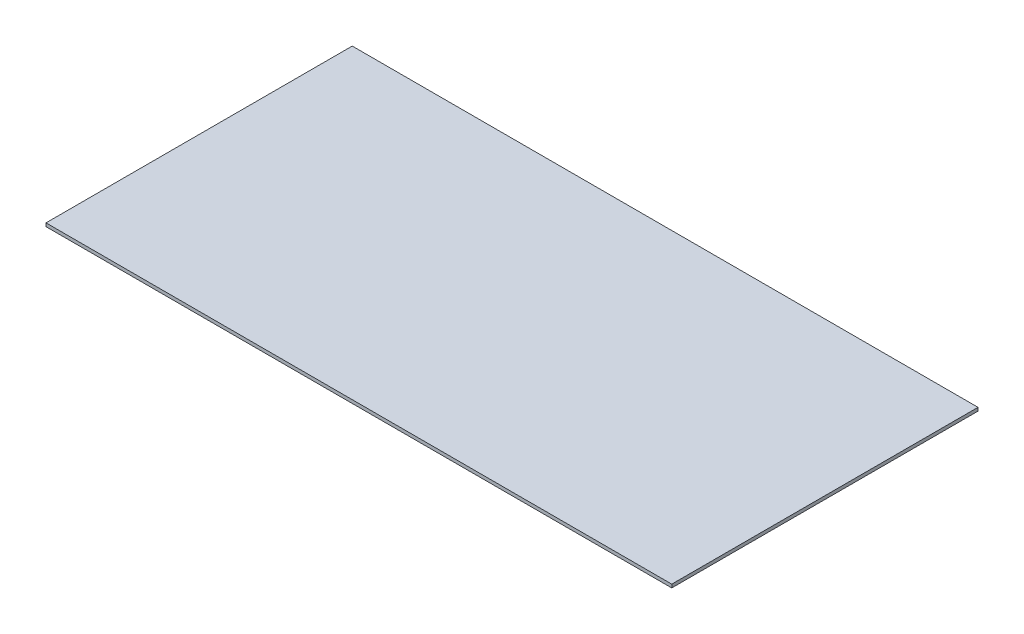
ISO-10303-21;
HEADER;
FILE_DESCRIPTION(('STEP AP214'),'2;1');
FILE_NAME('part.step','',(''),(''),'','','');
FILE_SCHEMA(('AUTOMOTIVE_DESIGN { 1 0 10303 214 1 1 1 1 }'));
ENDSEC;
DATA;
#1=APPLICATION_CONTEXT('core data for automotive mechanical design processes');
#2=APPLICATION_PROTOCOL_DEFINITION('international standard','automotive_design',2000,#1);
#3=PRODUCT_CONTEXT('',#1,'mechanical');
#4=PRODUCT('Part','Part','',(#3));
#5=PRODUCT_RELATED_PRODUCT_CATEGORY('part','',(#4));
#6=PRODUCT_DEFINITION_FORMATION('','',#4);
#7=PRODUCT_DEFINITION_CONTEXT('part definition',#1,'design');
#8=PRODUCT_DEFINITION('design','',#6,#7);
#9=PRODUCT_DEFINITION_SHAPE('','',#8);
#10=(LENGTH_UNIT() NAMED_UNIT(*) SI_UNIT(.MILLI.,.METRE.));
#11=(NAMED_UNIT(*) PLANE_ANGLE_UNIT() SI_UNIT($,.RADIAN.));
#12=(NAMED_UNIT(*) SI_UNIT($,.STERADIAN.) SOLID_ANGLE_UNIT());
#13=UNCERTAINTY_MEASURE_WITH_UNIT(LENGTH_MEASURE(1.E-05),#10,'distance_accuracy_value','');
#14=(GEOMETRIC_REPRESENTATION_CONTEXT(3) GLOBAL_UNCERTAINTY_ASSIGNED_CONTEXT((#13)) GLOBAL_UNIT_ASSIGNED_CONTEXT((#10,
#11,#12)) REPRESENTATION_CONTEXT('',''));
#15=CARTESIAN_POINT('',(0.,0.,0.));
#16=DIRECTION('',(0.,0.,1.));
#17=DIRECTION('',(1.,0.,0.));
#18=AXIS2_PLACEMENT_3D('',#15,#16,#17);
#19=CARTESIAN_POINT('',(0.,3.,0.));
#20=DIRECTION('',(1.,0.,0.));
#21=DIRECTION('',(0.,0.,-1.));
#22=AXIS2_PLACEMENT_3D('',#19,#20,#21);
#23=PLANE('',#22);
#24=DIRECTION('',(0.,0.,1.));
#25=VECTOR('',#24,1.);
#26=CARTESIAN_POINT('',(0.,0.,0.));
#27=LINE('',#26,#25);
#28=CARTESIAN_POINT('',(0.,0.,-277.));
#29=VERTEX_POINT('',#28);
#30=CARTESIAN_POINT('',(0.,0.,0.));
#31=VERTEX_POINT('',#30);
#32=EDGE_CURVE('E96',#29,#31,#27,.T.);
#33=ORIENTED_EDGE('',*,*,#32,.T.);
#34=DIRECTION('',(0.,-1.,0.));
#35=VECTOR('',#34,1.);
#36=CARTESIAN_POINT('',(0.,3.,0.));
#37=LINE('',#36,#35);
#38=CARTESIAN_POINT('',(0.,3.,0.));
#39=VERTEX_POINT('',#38);
#40=EDGE_CURVE('E11',#39,#31,#37,.T.);
#41=ORIENTED_EDGE('',*,*,#40,.F.);
#42=DIRECTION('',(0.,0.,1.));
#43=VECTOR('',#42,1.);
#44=CARTESIAN_POINT('',(0.,3.,0.));
#45=LINE('',#44,#43);
#46=CARTESIAN_POINT('',(0.,3.,-277.));
#47=VERTEX_POINT('',#46);
#48=EDGE_CURVE('E84',#47,#39,#45,.T.);
#49=ORIENTED_EDGE('',*,*,#48,.F.);
#50=DIRECTION('',(0.,-1.,0.));
#51=VECTOR('',#50,1.);
#52=CARTESIAN_POINT('',(0.,3.,-277.));
#53=LINE('',#52,#51);
#54=EDGE_CURVE('E92',#47,#29,#53,.T.);
#55=ORIENTED_EDGE('',*,*,#54,.T.);
#56=EDGE_LOOP('',(#33,#41,#49,#55));
#57=FACE_BOUND('',#56,.T.);
#58=ADVANCED_FACE('F33',(#57),#23,.F.);
#59=CARTESIAN_POINT('',(0.,3.,0.));
#60=DIRECTION('',(0.,0.,-1.));
#61=DIRECTION('',(-1.,0.,0.));
#62=AXIS2_PLACEMENT_3D('',#59,#60,#61);
#63=PLANE('',#62);
#64=DIRECTION('',(1.,0.,0.));
#65=VECTOR('',#64,1.);
#66=CARTESIAN_POINT('',(0.,0.,0.));
#67=LINE('',#66,#65);
#68=CARTESIAN_POINT('',(566.,0.,0.));
#69=VERTEX_POINT('',#68);
#70=EDGE_CURVE('E88',#31,#69,#67,.T.);
#71=ORIENTED_EDGE('',*,*,#70,.T.);
#72=DIRECTION('',(0.,-1.,0.));
#73=VECTOR('',#72,1.);
#74=CARTESIAN_POINT('',(566.,3.,0.));
#75=LINE('',#74,#73);
#76=CARTESIAN_POINT('',(566.,3.,0.));
#77=VERTEX_POINT('',#76);
#78=EDGE_CURVE('E41',#77,#69,#75,.T.);
#79=ORIENTED_EDGE('',*,*,#78,.F.);
#80=DIRECTION('',(1.,0.,0.));
#81=VECTOR('',#80,1.);
#82=CARTESIAN_POINT('',(0.,3.,0.));
#83=LINE('',#82,#81);
#84=EDGE_CURVE('E79',#39,#77,#83,.T.);
#85=ORIENTED_EDGE('',*,*,#84,.F.);
#86=ORIENTED_EDGE('',*,*,#40,.T.);
#87=EDGE_LOOP('',(#71,#79,#85,#86));
#88=FACE_BOUND('',#87,.T.);
#89=ADVANCED_FACE('F87',(#88),#63,.F.);
#90=CARTESIAN_POINT('',(566.,3.,0.));
#91=DIRECTION('',(-1.,0.,0.));
#92=DIRECTION('',(0.,0.,1.));
#93=AXIS2_PLACEMENT_3D('',#90,#91,#92);
#94=PLANE('',#93);
#95=DIRECTION('',(0.,0.,-1.));
#96=VECTOR('',#95,1.);
#97=CARTESIAN_POINT('',(566.,0.,0.));
#98=LINE('',#97,#96);
#99=CARTESIAN_POINT('',(566.,0.,-277.));
#100=VERTEX_POINT('',#99);
#101=EDGE_CURVE('E66',#69,#100,#98,.T.);
#102=ORIENTED_EDGE('',*,*,#101,.T.);
#103=DIRECTION('',(0.,-1.,0.));
#104=VECTOR('',#103,1.);
#105=CARTESIAN_POINT('',(566.,3.,-277.));
#106=LINE('',#105,#104);
#107=CARTESIAN_POINT('',(566.,3.,-277.));
#108=VERTEX_POINT('',#107);
#109=EDGE_CURVE('E89',#108,#100,#106,.T.);
#110=ORIENTED_EDGE('',*,*,#109,.F.);
#111=DIRECTION('',(0.,0.,-1.));
#112=VECTOR('',#111,1.);
#113=CARTESIAN_POINT('',(566.,3.,0.));
#114=LINE('',#113,#112);
#115=EDGE_CURVE('E82',#77,#108,#114,.T.);
#116=ORIENTED_EDGE('',*,*,#115,.F.);
#117=ORIENTED_EDGE('',*,*,#78,.T.);
#118=EDGE_LOOP('',(#102,#110,#116,#117));
#119=FACE_BOUND('',#118,.T.);
#120=ADVANCED_FACE('F90',(#119),#94,.F.);
#121=CARTESIAN_POINT('',(0.,3.,-277.));
#122=DIRECTION('',(0.,0.,1.));
#123=DIRECTION('',(1.,0.,0.));
#124=AXIS2_PLACEMENT_3D('',#121,#122,#123);
#125=PLANE('',#124);
#126=DIRECTION('',(-1.,0.,0.));
#127=VECTOR('',#126,1.);
#128=CARTESIAN_POINT('',(0.,0.,-277.));
#129=LINE('',#128,#127);
#130=EDGE_CURVE('E72',#100,#29,#129,.T.);
#131=ORIENTED_EDGE('',*,*,#130,.T.);
#132=ORIENTED_EDGE('',*,*,#54,.F.);
#133=DIRECTION('',(-1.,0.,0.));
#134=VECTOR('',#133,1.);
#135=CARTESIAN_POINT('',(0.,3.,-277.));
#136=LINE('',#135,#134);
#137=EDGE_CURVE('E49',#108,#47,#136,.T.);
#138=ORIENTED_EDGE('',*,*,#137,.F.);
#139=ORIENTED_EDGE('',*,*,#109,.T.);
#140=EDGE_LOOP('',(#131,#132,#138,#139));
#141=FACE_BOUND('',#140,.T.);
#142=ADVANCED_FACE('F103',(#141),#125,.F.);
#143=CARTESIAN_POINT('',(0.,3.,0.));
#144=DIRECTION('',(0.,-1.,0.));
#145=DIRECTION('',(0.,0.,-1.));
#146=AXIS2_PLACEMENT_3D('',#143,#144,#145);
#147=PLANE('',#146);
#148=ORIENTED_EDGE('',*,*,#48,.T.);
#149=ORIENTED_EDGE('',*,*,#84,.T.);
#150=ORIENTED_EDGE('',*,*,#115,.T.);
#151=ORIENTED_EDGE('',*,*,#137,.T.);
#152=EDGE_LOOP('',(#148,#149,#150,#151));
#153=FACE_BOUND('',#152,.T.);
#154=ADVANCED_FACE('F80',(#153),#147,.F.);
#155=CARTESIAN_POINT('',(0.,0.,0.));
#156=DIRECTION('',(0.,-1.,0.));
#157=DIRECTION('',(0.,0.,-1.));
#158=AXIS2_PLACEMENT_3D('',#155,#156,#157);
#159=PLANE('',#158);
#160=ORIENTED_EDGE('',*,*,#32,.F.);
#161=ORIENTED_EDGE('',*,*,#130,.F.);
#162=ORIENTED_EDGE('',*,*,#101,.F.);
#163=ORIENTED_EDGE('',*,*,#70,.F.);
#164=EDGE_LOOP('',(#160,#161,#162,#163));
#165=FACE_BOUND('',#164,.T.);
#166=ADVANCED_FACE('F106',(#165),#159,.T.);
#167=CLOSED_SHELL('',(#58,#89,#120,#142,#154,#166));
#168=MANIFOLD_SOLID_BREP('B2',#167);
#169=ADVANCED_BREP_SHAPE_REPRESENTATION('',(#18,#168),#14);
#170=SHAPE_DEFINITION_REPRESENTATION(#9,#169);
ENDSEC;
END-ISO-10303-21;
